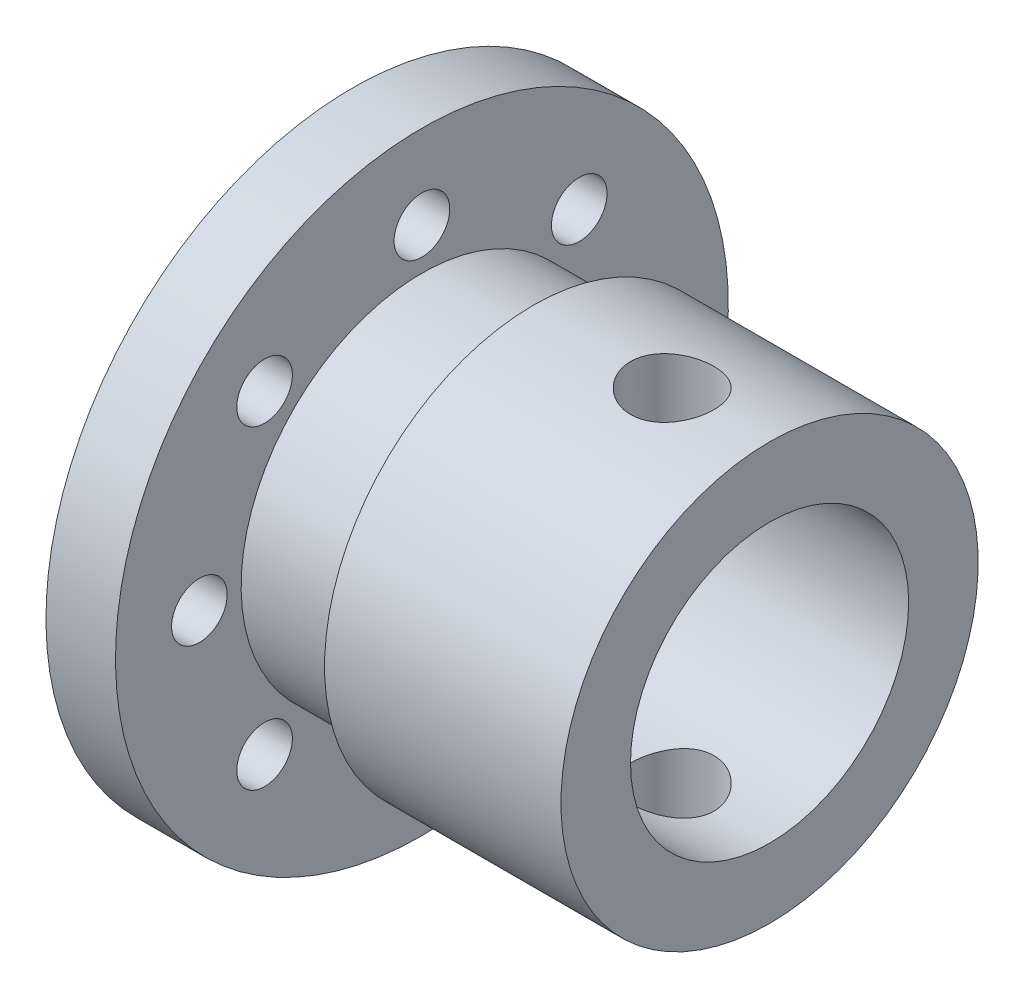
ISO-10303-21;
HEADER;
FILE_DESCRIPTION(('STEP AP214'),'2;1');
FILE_NAME('part.step','',(''),(''),'','','');
FILE_SCHEMA(('AUTOMOTIVE_DESIGN { 1 0 10303 214 1 1 1 1 }'));
ENDSEC;
DATA;
#1=APPLICATION_CONTEXT('core data for automotive mechanical design processes');
#2=APPLICATION_PROTOCOL_DEFINITION('international standard','automotive_design',2000,#1);
#3=PRODUCT_CONTEXT('',#1,'mechanical');
#4=PRODUCT('Part','Part','',(#3));
#5=PRODUCT_RELATED_PRODUCT_CATEGORY('part','',(#4));
#6=PRODUCT_DEFINITION_FORMATION('','',#4);
#7=PRODUCT_DEFINITION_CONTEXT('part definition',#1,'design');
#8=PRODUCT_DEFINITION('design','',#6,#7);
#9=PRODUCT_DEFINITION_SHAPE('','',#8);
#10=(LENGTH_UNIT() NAMED_UNIT(*) SI_UNIT(.MILLI.,.METRE.));
#11=(NAMED_UNIT(*) PLANE_ANGLE_UNIT() SI_UNIT($,.RADIAN.));
#12=(NAMED_UNIT(*) SI_UNIT($,.STERADIAN.) SOLID_ANGLE_UNIT());
#13=UNCERTAINTY_MEASURE_WITH_UNIT(LENGTH_MEASURE(1.E-05),#10,'distance_accuracy_value','');
#14=(GEOMETRIC_REPRESENTATION_CONTEXT(3) GLOBAL_UNCERTAINTY_ASSIGNED_CONTEXT((#13)) GLOBAL_UNIT_ASSIGNED_CONTEXT((#10,
#11,#12)) REPRESENTATION_CONTEXT('',''));
#15=CARTESIAN_POINT('',(0.,0.,0.));
#16=DIRECTION('',(0.,0.,1.));
#17=DIRECTION('',(1.,0.,0.));
#18=AXIS2_PLACEMENT_3D('',#15,#16,#17);
#19=CARTESIAN_POINT('',(542.916757591881,0.,0.));
#20=DIRECTION('',(-1.,0.,0.));
#21=DIRECTION('',(0.,-1.,0.));
#22=AXIS2_PLACEMENT_3D('',#19,#20,#21);
#23=CYLINDRICAL_SURFACE('',#22,11.0166045821102);
#24=CARTESIAN_POINT('',(545.650925036608,0.,0.));
#25=DIRECTION('',(-1.,0.,0.));
#26=DIRECTION('',(0.,-1.,0.));
#27=AXIS2_PLACEMENT_3D('',#24,#25,#26);
#28=CIRCLE('',#27,11.0166045821102);
#29=CARTESIAN_POINT('',(545.650925036608,-11.0166045821102,0.));
#30=VERTEX_POINT('',#29);
#31=EDGE_CURVE('E46',#30,#30,#28,.T.);
#32=ORIENTED_EDGE('',*,*,#31,.F.);
#33=EDGE_LOOP('',(#32));
#34=FACE_BOUND('',#33,.T.);
#35=CARTESIAN_POINT('',(548.150925036608,0.,0.));
#36=DIRECTION('',(-1.,0.,0.));
#37=DIRECTION('',(0.,-1.,0.));
#38=AXIS2_PLACEMENT_3D('',#35,#36,#37);
#39=CIRCLE('',#38,11.0166045821102);
#40=CARTESIAN_POINT('',(548.150925036608,-11.0166045821102,0.));
#41=VERTEX_POINT('',#40);
#42=EDGE_CURVE('E10',#41,#41,#39,.T.);
#43=ORIENTED_EDGE('',*,*,#42,.T.);
#44=EDGE_LOOP('',(#43));
#45=FACE_BOUND('',#44,.T.);
#46=ADVANCED_FACE('F34',(#34,#45),#23,.T.);
#47=CARTESIAN_POINT('',(545.650925036608,11.0166045821102,0.));
#48=DIRECTION('',(1.,0.,0.));
#49=DIRECTION('',(0.,1.,0.));
#50=AXIS2_PLACEMENT_3D('',#47,#48,#49);
#51=PLANE('',#50);
#52=CARTESIAN_POINT('',(545.650925036608,8.0000000000001,0.));
#53=DIRECTION('',(1.,0.,0.));
#54=DIRECTION('',(0.,1.,0.));
#55=AXIS2_PLACEMENT_3D('',#52,#53,#54);
#56=CIRCLE('',#55,1.);
#57=CARTESIAN_POINT('',(545.650925036608,9.0000000000001,0.));
#58=VERTEX_POINT('',#57);
#59=EDGE_CURVE('E59',#58,#58,#56,.T.);
#60=ORIENTED_EDGE('',*,*,#59,.T.);
#61=EDGE_LOOP('',(#60));
#62=FACE_BOUND('',#61,.T.);
#63=CARTESIAN_POINT('',(545.650925036608,5.65685424949288,-5.65685424949255));
#64=DIRECTION('',(1.,0.,0.));
#65=DIRECTION('',(0.,1.,0.));
#66=AXIS2_PLACEMENT_3D('',#63,#64,#65);
#67=CIRCLE('',#66,1.00000000000006);
#68=CARTESIAN_POINT('',(545.650925036608,6.65685424949294,-5.65685424949255));
#69=VERTEX_POINT('',#68);
#70=EDGE_CURVE('E113',#69,#69,#67,.T.);
#71=ORIENTED_EDGE('',*,*,#70,.T.);
#72=EDGE_LOOP('',(#71));
#73=FACE_BOUND('',#72,.T.);
#74=CARTESIAN_POINT('',(545.650925036608,6.67199061268785E-13,-8.00000000000057));
#75=DIRECTION('',(1.,0.,0.));
#76=DIRECTION('',(0.,1.,0.));
#77=AXIS2_PLACEMENT_3D('',#74,#75,#76);
#78=CIRCLE('',#77,1.0000000000004);
#79=CARTESIAN_POINT('',(545.650925036608,1.00000000000107,-8.00000000000057));
#80=VERTEX_POINT('',#79);
#81=EDGE_CURVE('E117',#80,#80,#78,.T.);
#82=ORIENTED_EDGE('',*,*,#81,.T.);
#83=EDGE_LOOP('',(#82));
#84=FACE_BOUND('',#83,.T.);
#85=CARTESIAN_POINT('',(545.650925036608,-5.65685424949188,-5.65685424949335));
#86=DIRECTION('',(1.,0.,0.));
#87=DIRECTION('',(0.,1.,0.));
#88=AXIS2_PLACEMENT_3D('',#85,#86,#87);
#89=CIRCLE('',#88,1.00000000000085);
#90=CARTESIAN_POINT('',(545.650925036608,-4.65685424949103,-5.65685424949335));
#91=VERTEX_POINT('',#90);
#92=EDGE_CURVE('E121',#91,#91,#89,.T.);
#93=ORIENTED_EDGE('',*,*,#92,.T.);
#94=EDGE_LOOP('',(#93));
#95=FACE_BOUND('',#94,.T.);
#96=CARTESIAN_POINT('',(545.650925036608,-7.9999999999999,-1.13392922489821E-12));
#97=DIRECTION('',(1.,0.,0.));
#98=DIRECTION('',(0.,1.,0.));
#99=AXIS2_PLACEMENT_3D('',#96,#97,#98);
#100=CIRCLE('',#99,1.00000000000114);
#101=CARTESIAN_POINT('',(545.650925036608,-6.99999999999876,-1.13392922489821E-12));
#102=VERTEX_POINT('',#101);
#103=EDGE_CURVE('E125',#102,#102,#100,.T.);
#104=ORIENTED_EDGE('',*,*,#103,.T.);
#105=EDGE_LOOP('',(#104));
#106=FACE_BOUND('',#105,.T.);
#107=CARTESIAN_POINT('',(545.650925036608,-5.65685424949268,5.65685424949141));
#108=DIRECTION('',(1.,0.,0.));
#109=DIRECTION('',(0.,1.,0.));
#110=AXIS2_PLACEMENT_3D('',#107,#108,#109);
#111=CIRCLE('',#110,1.00000000000111);
#112=CARTESIAN_POINT('',(545.650925036608,-4.65685424949157,5.65685424949141));
#113=VERTEX_POINT('',#112);
#114=EDGE_CURVE('E129',#113,#113,#111,.T.);
#115=ORIENTED_EDGE('',*,*,#114,.T.);
#116=EDGE_LOOP('',(#115));
#117=FACE_BOUND('',#116,.T.);
#118=CARTESIAN_POINT('',(545.650925036608,-4.6770988106874E-13,7.99999999999943));
#119=DIRECTION('',(1.,0.,0.));
#120=DIRECTION('',(0.,1.,0.));
#121=AXIS2_PLACEMENT_3D('',#118,#119,#120);
#122=CIRCLE('',#121,1.00000000000079);
#123=CARTESIAN_POINT('',(545.650925036608,1.00000000000032,7.99999999999943));
#124=VERTEX_POINT('',#123);
#125=EDGE_CURVE('E133',#124,#124,#122,.T.);
#126=ORIENTED_EDGE('',*,*,#125,.T.);
#127=EDGE_LOOP('',(#126));
#128=FACE_BOUND('',#127,.T.);
#129=CARTESIAN_POINT('',(545.650925036608,5.65685424949208,5.65685424949222));
#130=DIRECTION('',(1.,0.,0.));
#131=DIRECTION('',(0.,1.,0.));
#132=AXIS2_PLACEMENT_3D('',#129,#130,#131);
#133=CIRCLE('',#132,1.00000000000037);
#134=CARTESIAN_POINT('',(545.650925036608,6.65685424949245,5.65685424949222));
#135=VERTEX_POINT('',#134);
#136=EDGE_CURVE('E88',#135,#135,#133,.T.);
#137=ORIENTED_EDGE('',*,*,#136,.T.);
#138=EDGE_LOOP('',(#137));
#139=FACE_BOUND('',#138,.T.);
#140=CARTESIAN_POINT('',(545.650925036608,0.,0.));
#141=DIRECTION('',(-1.,0.,0.));
#142=DIRECTION('',(0.,-1.,0.));
#143=AXIS2_PLACEMENT_3D('',#140,#141,#142);
#144=CIRCLE('',#143,5.);
#145=CARTESIAN_POINT('',(545.650925036608,-5.,0.));
#146=VERTEX_POINT('',#145);
#147=EDGE_CURVE('E51',#146,#146,#144,.T.);
#148=ORIENTED_EDGE('',*,*,#147,.F.);
#149=EDGE_LOOP('',(#148));
#150=FACE_BOUND('',#149,.T.);
#151=ORIENTED_EDGE('',*,*,#31,.T.);
#152=EDGE_LOOP('',(#151));
#153=FACE_BOUND('',#152,.T.);
#154=ADVANCED_FACE('F98',(#62,#73,#84,#95,#106,#117,#128,#139,#150,#153),#51,.F.);
#155=CARTESIAN_POINT('',(542.916757591881,0.,0.));
#156=DIRECTION('',(-1.,0.,0.));
#157=DIRECTION('',(0.,-1.,0.));
#158=AXIS2_PLACEMENT_3D('',#155,#156,#157);
#159=CYLINDRICAL_SURFACE('',#158,5.);
#160=CARTESIAN_POINT('',(558.650925036608,-4.99999999999999,0.));
#161=CARTESIAN_POINT('',(558.650924039123,-4.99999929250549,0.082288612753296));
#162=CARTESIAN_POINT('',(558.644131172984,-4.99794915693953,0.164587318351522));
#163=CARTESIAN_POINT('',(558.617203682386,-4.98997105593691,0.326788125304866));
#164=CARTESIAN_POINT('',(558.597065078585,-4.98404193389692,0.406689504411403));
#165=CARTESIAN_POINT('',(558.544179019698,-4.96895552501836,0.561732707754496));
#166=CARTESIAN_POINT('',(558.511450166989,-4.95980300250425,0.636881364395333));
#167=CARTESIAN_POINT('',(558.434388943552,-4.93922109237646,0.780624181053083));
#168=CARTESIAN_POINT('',(558.390055029213,-4.92779140192067,0.849217467469621));
#169=CARTESIAN_POINT('',(558.289701029136,-4.90350737192774,0.979871797183694));
#170=CARTESIAN_POINT('',(558.233408410722,-4.89062383657037,1.04171807124429));
#171=CARTESIAN_POINT('',(558.111315806698,-4.86505834210443,1.15524920923319));
#172=CARTESIAN_POINT('',(558.045514224483,-4.85237641724502,1.20693236327436));
#173=CARTESIAN_POINT('',(557.904454283571,-4.82834113993772,1.29980037723705));
#174=CARTESIAN_POINT('',(557.829016575618,-4.81702406663875,1.34072309022211));
#175=CARTESIAN_POINT('',(557.671935782378,-4.79743620394031,1.40921394774759));
#176=CARTESIAN_POINT('',(557.59029419268,-4.7891646831331,1.43678529919973));
#177=CARTESIAN_POINT('',(557.425534770478,-4.77690870838434,1.47701633682651));
#178=CARTESIAN_POINT('',(557.342522292744,-4.77281069324533,1.49007196234675));
#179=CARTESIAN_POINT('',(557.175391880392,-4.76902789749768,1.50213730614668));
#180=CARTESIAN_POINT('',(557.091274218549,-4.76934204760572,1.50115042761075));
#181=CARTESIAN_POINT('',(556.927541128,-4.77424744067778,1.48546977199808));
#182=CARTESIAN_POINT('',(556.847872786246,-4.77868388599141,1.47127205262682));
#183=CARTESIAN_POINT('',(556.692105250335,-4.79108356228625,1.43037420427051));
#184=CARTESIAN_POINT('',(556.616006409234,-4.79904714132352,1.40367284141634));
#185=CARTESIAN_POINT('',(556.468324686948,-4.81772733074975,1.33816026653674));
#186=CARTESIAN_POINT('',(556.396817952653,-4.82848016115953,1.29918816934636));
#187=CARTESIAN_POINT('',(556.261193014598,-4.85150987000065,1.2103522258868));
#188=CARTESIAN_POINT('',(556.197076607195,-4.86378711746991,1.16048574002589));
#189=CARTESIAN_POINT('',(556.075238845846,-4.88911011297936,1.04881290765548));
#190=CARTESIAN_POINT('',(556.017896372579,-4.90216654310498,0.986594907466968));
#191=CARTESIAN_POINT('',(555.914371052544,-4.92712244063258,0.853263259313953));
#192=CARTESIAN_POINT('',(555.868188908194,-4.93902183518409,0.782149051860888));
#193=CARTESIAN_POINT('',(555.788065114144,-4.9604316006947,0.6323550383428));
#194=CARTESIAN_POINT('',(555.754207520358,-4.96992543668314,0.553627749747927));
#195=CARTESIAN_POINT('',(555.700325446509,-4.98533521832222,0.391245415603492));
#196=CARTESIAN_POINT('',(555.680297108076,-4.99125216186999,0.307591751589572));
#197=CARTESIAN_POINT('',(555.655272858709,-4.99868364643538,0.140952242668339));
#198=CARTESIAN_POINT('',(555.649763450807,-5.0003485041779,0.0580500976011944));
#199=CARTESIAN_POINT('',(555.65249419232,-4.99952923241759,-0.107499605823373));
#200=CARTESIAN_POINT('',(555.66073250626,-4.99704565677756,-0.190147196690767));
#201=CARTESIAN_POINT('',(555.69030964772,-4.98830696987162,-0.350903605309685));
#202=CARTESIAN_POINT('',(555.711348424189,-4.98213829799416,-0.429072772614161));
#203=CARTESIAN_POINT('',(555.765568269387,-4.96674347841532,-0.580754638954507));
#204=CARTESIAN_POINT('',(555.798750797646,-4.95751696321085,-0.654266777025559));
#205=CARTESIAN_POINT('',(555.87717820209,-4.93669654351324,-0.796437189461043));
#206=CARTESIAN_POINT('',(555.922684377556,-4.92505280829674,-0.864943826199686));
#207=CARTESIAN_POINT('',(556.024149790661,-4.90073468764317,-0.993523307980161));
#208=CARTESIAN_POINT('',(556.080111648496,-4.8880600443108,-1.05359403235593));
#209=CARTESIAN_POINT('',(556.203312344978,-4.86253171869138,-1.16585744551025));
#210=CARTESIAN_POINT('',(556.27088691238,-4.84968825033267,-1.21768481231502));
#211=CARTESIAN_POINT('',(556.414052975622,-4.82576515238463,-1.30928995072153));
#212=CARTESIAN_POINT('',(556.489644261167,-4.81468547654651,-1.34906803829472));
#213=CARTESIAN_POINT('',(556.646457527863,-4.79567189615055,-1.41517347127167));
#214=CARTESIAN_POINT('',(556.727651223145,-4.78772337843827,-1.44156346937048));
#215=CARTESIAN_POINT('',(556.89361300554,-4.77591594362794,-1.48021730815112));
#216=CARTESIAN_POINT('',(556.978379857396,-4.77205562508301,-1.49248598978776));
#217=CARTESIAN_POINT('',(557.145286554985,-4.76899972496088,-1.50221984485055));
#218=CARTESIAN_POINT('',(557.227388687626,-4.76961647442755,-1.50028055308486));
#219=CARTESIAN_POINT('',(557.390039139981,-4.77499401288295,-1.48307505444811));
#220=CARTESIAN_POINT('',(557.470587521785,-4.77975463592552,-1.46780938124713));
#221=CARTESIAN_POINT('',(557.626870435751,-4.79275763670387,-1.42476888804131));
#222=CARTESIAN_POINT('',(557.70265232397,-4.80095604545966,-1.39715175507061));
#223=CARTESIAN_POINT('',(557.848567475426,-4.81990278909138,-1.33031507121121));
#224=CARTESIAN_POINT('',(557.918699654249,-4.83065161194313,-1.29109329962869));
#225=CARTESIAN_POINT('',(558.054088153135,-4.85397676425834,-1.20048763805065));
#226=CARTESIAN_POINT('',(558.119073797869,-4.86660540163798,-1.14871276092988));
#227=CARTESIAN_POINT('',(558.239627534916,-4.89201320450026,-1.03517434629778));
#228=CARTESIAN_POINT('',(558.295193176076,-4.90479240823905,-0.973408217134478));
#229=CARTESIAN_POINT('',(558.396948448903,-4.92950936570648,-0.839465762183245));
#230=CARTESIAN_POINT('',(558.442816483464,-4.94141159765674,-0.767037885790604));
#231=CARTESIAN_POINT('',(558.521660206512,-4.96260680455813,-0.615141373983509));
#232=CARTESIAN_POINT('',(558.554641924883,-4.97190099931066,-0.53567605299892));
#233=CARTESIAN_POINT('',(558.603820312261,-4.98602174969301,-0.380757712655246));
#234=CARTESIAN_POINT('',(558.621436709492,-4.99122027381067,-0.305786961954212));
#235=CARTESIAN_POINT('',(558.64498856185,-4.99820944494492,-0.153880195230774));
#236=CARTESIAN_POINT('',(558.650925969313,-5.0000006615474,-0.0769445098581367));
#237=CARTESIAN_POINT('',(558.650925036608,-4.99999999999999,0.));
#238=B_SPLINE_CURVE_WITH_KNOTS('',3,(#160,#161,#162,#163,#164,#165,#166,#167,#168,#169,#170,
#171,#172,#173,#174,#175,#176,#177,#178,#179,#180,#181,#182,#183,#184,#185,#186,#187,#188,#189,
#190,#191,#192,#193,#194,#195,#196,#197,#198,#199,#200,#201,#202,#203,#204,#205,#206,#207,#208,
#209,#210,#211,#212,#213,#214,#215,#216,#217,#218,#219,#220,#221,#222,#223,#224,#225,#226,#227,
#228,#229,#230,#231,#232,#233,#234,#235,#236,#237),.UNSPECIFIED.,.T.,.F.,(4,2,2,2,2,2,2,2,2,2,2,
2,2,2,2,2,2,2,2,2,2,2,2,2,2,2,2,2,2,2,2,2,2,2,2,2,2,2,4),(0.,0.246583203612596,
0.493239964845979,0.739533676300825,0.985860164412644,1.23855602948184,1.49129437288625,
1.74971481004113,2.00807314543224,2.25919689356601,2.51025978319085,2.75226016697675,
2.99428443658001,3.23962426447117,3.48502360158542,3.74067104048159,3.99633456531061,
4.25371046881682,4.51101453528798,4.75908809438535,5.00712853550315,5.24956746682316,
5.4920355459372,5.74011305702905,5.98825282000178,6.24540400322805,6.50254844252674,
6.75847814951236,7.01432009460275,7.25950155466926,7.50467319661588,7.74680040402715,
7.98897397553104,8.23996925679914,8.49102974897479,8.74942996156656,9.0077091159522,
9.23831691930441,9.46888616948855),.UNSPECIFIED.);
#239=CARTESIAN_POINT('',(558.650925036608,-4.99999999999999,0.));
#240=VERTEX_POINT('',#239);
#241=EDGE_CURVE('E87',#240,#240,#238,.T.);
#242=ORIENTED_EDGE('',*,*,#241,.T.);
#243=EDGE_LOOP('',(#242));
#244=FACE_BOUND('',#243,.T.);
#245=CARTESIAN_POINT('',(557.150925036608,4.76969600708474,1.49999999999997));
#246=CARTESIAN_POINT('',(557.233119584551,4.76969685726981,1.49999897633761));
#247=CARTESIAN_POINT('',(557.315324260752,4.7718439020907,1.49322108167139));
#248=CARTESIAN_POINT('',(557.4773302862,4.78016578302901,1.46635844446746));
#249=CARTESIAN_POINT('',(557.55713082311,4.78634196493469,1.44626925573575));
#250=CARTESIAN_POINT('',(557.71195976488,4.80196102485633,1.39352753269952));
#251=CARTESIAN_POINT('',(557.786995866241,4.81139846703233,1.36089589394239));
#252=CARTESIAN_POINT('',(557.930546970604,4.83246932547569,1.28406421917923));
#253=CARTESIAN_POINT('',(557.999060995293,4.84410307041021,1.23986245137047));
#254=CARTESIAN_POINT('',(558.129791427186,4.86866862185766,1.13964754141622));
#255=CARTESIAN_POINT('',(558.191770934554,4.88162808311637,1.08333207175803));
#256=CARTESIAN_POINT('',(558.305562987931,4.90714861936757,0.961136237579577));
#257=CARTESIAN_POINT('',(558.357374227058,4.91970964297705,0.895254645461102));
#258=CARTESIAN_POINT('',(558.450387736442,4.94333214579389,0.754111437793699));
#259=CARTESIAN_POINT('',(558.491348461051,4.95435724342404,0.67868402133583));
#260=CARTESIAN_POINT('',(558.559912295651,4.97334435920684,0.521624645369365));
#261=CARTESIAN_POINT('',(558.587518286466,4.98130703789495,0.439994028387911));
#262=CARTESIAN_POINT('',(558.627805037699,4.99307646003589,0.275323852630831));
#263=CARTESIAN_POINT('',(558.640890164261,4.99699557369338,0.192391398953818));
#264=CARTESIAN_POINT('',(558.653042361255,5.00063201501348,0.0254218237493622));
#265=CARTESIAN_POINT('',(558.65211237601,5.00035022521079,-0.0586150620503067));
#266=CARTESIAN_POINT('',(558.636532168065,4.99569603817659,-0.222571156600092));
#267=CARTESIAN_POINT('',(558.622319842799,4.99145420205261,-0.30253626764128));
#268=CARTESIAN_POINT('',(558.581293700614,4.97951522112593,-0.45888921344247));
#269=CARTESIAN_POINT('',(558.554479085666,4.97181785750587,-0.535276821322788));
#270=CARTESIAN_POINT('',(558.48871301319,4.95365220986964,-0.683347326351229));
#271=CARTESIAN_POINT('',(558.449623833801,4.94315269676706,-0.754965064694433));
#272=CARTESIAN_POINT('',(558.36052718418,4.9204964064807,-0.890764673783103));
#273=CARTESIAN_POINT('',(558.310517123645,4.90833923637779,-0.954944774872065));
#274=CARTESIAN_POINT('',(558.198727285857,4.88311550488167,-1.07666048152973));
#275=CARTESIAN_POINT('',(558.136568117579,4.87003195321462,-1.13384458040106));
#276=CARTESIAN_POINT('',(558.003415018718,4.84483979887498,-1.23707651539819));
#277=CARTESIAN_POINT('',(557.932420211219,4.83273129317021,-1.28312324482847));
#278=CARTESIAN_POINT('',(557.782685567359,4.8107790319768,-1.36313995335442));
#279=CARTESIAN_POINT('',(557.703877990745,4.80095810695959,-1.3969898923767));
#280=CARTESIAN_POINT('',(557.541317828163,4.78496392548438,-1.45083362878407));
#281=CARTESIAN_POINT('',(557.457566865074,4.77878947915831,-1.47083194640555));
#282=CARTESIAN_POINT('',(557.290842675869,4.77104849541243,-1.49574770282162));
#283=CARTESIAN_POINT('',(557.207956812714,4.76931878670441,-1.50119946380209));
#284=CARTESIAN_POINT('',(557.042452136598,4.77021192441925,-1.49835947233058));
#285=CARTESIAN_POINT('',(556.959833287877,4.7728341615659,-1.49006964371326));
#286=CARTESIAN_POINT('',(556.799436658638,4.78197558554913,-1.46045763574187));
#287=CARTESIAN_POINT('',(556.721588872345,4.7883917650749,-1.43947961431277));
#288=CARTESIAN_POINT('',(556.570523345794,4.80429141231228,-1.38548577747937));
#289=CARTESIAN_POINT('',(556.497306322468,4.81377535359074,-1.35246810342758));
#290=CARTESIAN_POINT('',(556.355407572536,4.83505835023047,-1.274318711965));
#291=CARTESIAN_POINT('',(556.286900315623,4.84691271069798,-1.22888564172729));
#292=CARTESIAN_POINT('',(556.158286930428,4.87148205646987,-1.12755301600386));
#293=CARTESIAN_POINT('',(556.098182818996,4.88419724730003,-1.07165095534899));
#294=CARTESIAN_POINT('',(555.985744630794,4.90963633548158,-0.948455132493624));
#295=CARTESIAN_POINT('',(555.933789407621,4.92234245063004,-0.880811065857457));
#296=CARTESIAN_POINT('',(555.841958335581,4.9458485174865,-0.737461784590272));
#297=CARTESIAN_POINT('',(555.802081886827,4.95664856384717,-0.661756970543967));
#298=CARTESIAN_POINT('',(555.73592500604,4.97505970474957,-0.504935504705247));
#299=CARTESIAN_POINT('',(555.709543020449,4.98269453424965,-0.423864622037867));
#300=CARTESIAN_POINT('',(555.670864117718,4.99401979596826,-0.258169966504623));
#301=CARTESIAN_POINT('',(555.65856317066,4.9977113567088,-0.173547217354802));
#302=CARTESIAN_POINT('',(555.648701992554,5.00066544081399,-0.00665215388278732));
#303=CARTESIAN_POINT('',(555.650592341201,5.00009305111322,0.0755851790861622));
#304=CARTESIAN_POINT('',(555.667746669107,4.99497264465037,0.238519481164354));
#305=CARTESIAN_POINT('',(555.683009890089,4.99042485330463,0.319216537346474));
#306=CARTESIAN_POINT('',(555.726136698008,4.97791168358327,0.475935813041313));
#307=CARTESIAN_POINT('',(555.753863217257,4.96998352900866,0.551998927351361));
#308=CARTESIAN_POINT('',(555.821006951116,4.9515294303945,0.698433237752022));
#309=CARTESIAN_POINT('',(555.860426086895,4.94100305949947,0.768803496050534));
#310=CARTESIAN_POINT('',(555.951298494038,4.91803965828229,0.904301892420538));
#311=CARTESIAN_POINT('',(556.003096466609,4.90555226923559,0.969190250076776));
#312=CARTESIAN_POINT('',(556.116635424941,4.88023537212333,1.08953757134596));
#313=CARTESIAN_POINT('',(556.178379274506,4.86740576641079,1.14499380960193));
#314=CARTESIAN_POINT('',(556.312265814919,4.8424068063132,1.24656269394545));
#315=CARTESIAN_POINT('',(556.384663589999,4.83026852693486,1.29234759757952));
#316=CARTESIAN_POINT('',(556.536480210769,4.80852547508795,1.3710431352877));
#317=CARTESIAN_POINT('',(556.615895660209,4.79891948596957,1.40395995557282));
#318=CARTESIAN_POINT('',(556.770665468214,4.78427816717596,1.45301942532944));
#319=CARTESIAN_POINT('',(556.845533683539,4.77886154840521,1.47058859011227));
#320=CARTESIAN_POINT('',(556.997240259104,4.77157042597168,1.4940781883514));
#321=CARTESIAN_POINT('',(557.074078221254,4.76969521221432,1.50000095706092));
#322=CARTESIAN_POINT('',(557.150925036608,4.76969600708474,1.49999999999997));
#323=B_SPLINE_CURVE_WITH_KNOTS('',3,(#245,#246,#247,#248,#249,#250,#251,#252,#253,#254,#255,
#256,#257,#258,#259,#260,#261,#262,#263,#264,#265,#266,#267,#268,#269,#270,#271,#272,#273,#274,
#275,#276,#277,#278,#279,#280,#281,#282,#283,#284,#285,#286,#287,#288,#289,#290,#291,#292,#293,
#294,#295,#296,#297,#298,#299,#300,#301,#302,#303,#304,#305,#306,#307,#308,#309,#310,#311,#312,
#313,#314,#315,#316,#317,#318,#319,#320,#321,#322),.UNSPECIFIED.,.T.,.F.,(4,2,2,2,2,2,2,2,2,2,2,
2,2,2,2,2,2,2,2,2,2,2,2,2,2,2,2,2,2,2,2,2,2,2,2,2,2,2,4),(0.,0.24630016591559,0.492682641688965,
0.738656414466256,0.984667025370109,1.23773150007977,1.49082847871264,1.74915939273633,
2.00743455587871,2.25832140149547,2.50915554101425,2.75200125990867,2.99486235890362,
3.24055209335667,3.48630016590818,3.74152147023258,3.99676812491846,4.25446238246235,
4.51207250628395,4.76008080790304,5.00805439107374,5.24958594938805,5.49115481045764,
5.73920731809361,5.98731925928902,6.24479506100576,6.50225807324179,6.75775391814304,
7.01317662321659,7.25876303911197,7.50433553047731,7.74727096872197,7.99024634491357,
8.24099627054474,8.49181852629871,8.7501163966912,9.00828993963906,9.23861153857425,
9.46888695033538),.UNSPECIFIED.);
#324=CARTESIAN_POINT('',(557.150925036608,4.76969600708474,1.49999999999997));
#325=VERTEX_POINT('',#324);
#326=EDGE_CURVE('E80',#325,#325,#323,.T.);
#327=ORIENTED_EDGE('',*,*,#326,.T.);
#328=EDGE_LOOP('',(#327));
#329=FACE_BOUND('',#328,.T.);
#330=CARTESIAN_POINT('',(560.650925036608,0.,0.));
#331=DIRECTION('',(-1.,0.,0.));
#332=DIRECTION('',(0.,-1.,0.));
#333=AXIS2_PLACEMENT_3D('',#330,#331,#332);
#334=CIRCLE('',#333,5.);
#335=CARTESIAN_POINT('',(560.650925036608,-4.99999999999999,0.));
#336=VERTEX_POINT('',#335);
#337=EDGE_CURVE('E142',#336,#336,#334,.T.);
#338=ORIENTED_EDGE('',*,*,#337,.F.);
#339=EDGE_LOOP('',(#338));
#340=FACE_BOUND('',#339,.T.);
#341=ORIENTED_EDGE('',*,*,#147,.T.);
#342=EDGE_LOOP('',(#341));
#343=FACE_BOUND('',#342,.T.);
#344=ADVANCED_FACE('F94',(#244,#329,#340,#343),#159,.F.);
#345=CARTESIAN_POINT('',(560.650925036608,5.,0.));
#346=DIRECTION('',(-1.,0.,0.));
#347=DIRECTION('',(0.,-1.,0.));
#348=AXIS2_PLACEMENT_3D('',#345,#346,#347);
#349=PLANE('',#348);
#350=CARTESIAN_POINT('',(560.650925036608,0.,0.));
#351=DIRECTION('',(-1.,0.,0.));
#352=DIRECTION('',(0.,-1.,0.));
#353=AXIS2_PLACEMENT_3D('',#350,#351,#352);
#354=CIRCLE('',#353,7.5);
#355=CARTESIAN_POINT('',(560.650925036608,-7.49999999999999,0.));
#356=VERTEX_POINT('',#355);
#357=EDGE_CURVE('E144',#356,#356,#354,.T.);
#358=ORIENTED_EDGE('',*,*,#357,.F.);
#359=EDGE_LOOP('',(#358));
#360=FACE_BOUND('',#359,.T.);
#361=ORIENTED_EDGE('',*,*,#337,.T.);
#362=EDGE_LOOP('',(#361));
#363=FACE_BOUND('',#362,.T.);
#364=ADVANCED_FACE('F97',(#360,#363),#349,.F.);
#365=CARTESIAN_POINT('',(542.916757591881,0.,0.));
#366=DIRECTION('',(-1.,0.,0.));
#367=DIRECTION('',(0.,-1.,0.));
#368=AXIS2_PLACEMENT_3D('',#365,#366,#367);
#369=CYLINDRICAL_SURFACE('',#368,7.5);
#370=CARTESIAN_POINT('',(558.650925036608,-7.49999999999999,0.));
#371=CARTESIAN_POINT('',(558.650921969861,-7.49999846371306,-0.0833653601889453));
#372=CARTESIAN_POINT('',(558.643951772157,-7.49859577767346,-0.166769490302273));
#373=CARTESIAN_POINT('',(558.616277286435,-7.49313548434846,-0.331220261533513));
#374=CARTESIAN_POINT('',(558.595562087406,-7.48907576790279,-0.412264976312018));
#375=CARTESIAN_POINT('',(558.541063126177,-7.4787547391743,-0.569595457894932));
#376=CARTESIAN_POINT('',(558.507291881341,-7.47249553615077,-0.645885701899641));
#377=CARTESIAN_POINT('',(558.427676665341,-7.45845597052972,-0.791711983296277));
#378=CARTESIAN_POINT('',(558.381833413198,-7.4506756985356,-0.861248422613676));
#379=CARTESIAN_POINT('',(558.278717295171,-7.43433247994954,-0.99254021597226));
#380=CARTESIAN_POINT('',(558.221312503522,-7.42576118256521,-1.05419092673774));
#381=CARTESIAN_POINT('',(558.096986412021,-7.40886270678883,-1.16705513491199));
#382=CARTESIAN_POINT('',(558.030064369606,-7.40053554750636,-1.21826781715558));
#383=CARTESIAN_POINT('',(557.887850747091,-7.38498662718923,-1.30924763002138));
#384=CARTESIAN_POINT('',(557.812488570914,-7.37777561047419,-1.34890640829876));
#385=CARTESIAN_POINT('',(557.656002308102,-7.36539402087627,-1.41495849987042));
#386=CARTESIAN_POINT('',(557.574878791589,-7.36022324642943,-1.44135312365581));
#387=CARTESIAN_POINT('',(557.410298490747,-7.35259207878307,-1.47978794982719));
#388=CARTESIAN_POINT('',(557.326886220395,-7.35009705160782,-1.49201174693812));
#389=CARTESIAN_POINT('',(557.159160304562,-7.34799562590941,-1.50232819158915));
#390=CARTESIAN_POINT('',(557.074846752128,-7.34838893201761,-1.50042228407023));
#391=CARTESIAN_POINT('',(556.909054854577,-7.35198826722277,-1.48268185965271));
#392=CARTESIAN_POINT('',(556.827552928167,-7.35515179288145,-1.46705781036583));
#393=CARTESIAN_POINT('',(556.668350921614,-7.36386819240001,-1.42265682693457));
#394=CARTESIAN_POINT('',(556.59065102323,-7.36942118036667,-1.39387926465103));
#395=CARTESIAN_POINT('',(556.440652144053,-7.38233427750611,-1.32378717551208));
#396=CARTESIAN_POINT('',(556.368393217255,-7.38970634720557,-1.28238922684814));
#397=CARTESIAN_POINT('',(556.231768761649,-7.40541928159593,-1.18829036185897));
#398=CARTESIAN_POINT('',(556.167404141332,-7.41376025757549,-1.13558814653522));
#399=CARTESIAN_POINT('',(556.047180932923,-7.43065531862192,-1.01924990184087));
#400=CARTESIAN_POINT('',(555.99149618482,-7.43921053816357,-0.955434241818669));
#401=CARTESIAN_POINT('',(555.891594267157,-7.45543273071612,-0.819277536093032));
#402=CARTESIAN_POINT('',(555.847377244668,-7.46309969233459,-0.74693638106911));
#403=CARTESIAN_POINT('',(555.77163377277,-7.4767003524133,-0.595589080318429));
#404=CARTESIAN_POINT('',(555.740127196142,-7.48263133272407,-0.516572729378009));
#405=CARTESIAN_POINT('',(555.69088432555,-7.49207113481786,-0.354223464673041));
#406=CARTESIAN_POINT('',(555.673146363498,-7.49558025000796,-0.270891075108691));
#407=CARTESIAN_POINT('',(555.652190355917,-7.49974007800301,-0.103769108440723));
#408=CARTESIAN_POINT('',(555.648734407298,-7.50043761978704,-0.0200104924883693));
#409=CARTESIAN_POINT('',(555.655799825022,-7.49902577895153,0.146887401289046));
#410=CARTESIAN_POINT('',(555.666320405637,-7.49691655412169,0.230026713665654));
#411=CARTESIAN_POINT('',(555.700842596924,-7.49015748012026,0.392558489919779));
#412=CARTESIAN_POINT('',(555.724722139355,-7.48553064606309,0.471977922509838));
#413=CARTESIAN_POINT('',(555.785151010592,-7.47425328091549,0.625685441249479));
#414=CARTESIAN_POINT('',(555.821701288624,-7.4676025982134,0.699973142456269));
#415=CARTESIAN_POINT('',(555.906948772585,-7.45289867299941,0.842311760529285));
#416=CARTESIAN_POINT('',(555.955789208167,-7.44482925655577,0.910275190128261));
#417=CARTESIAN_POINT('',(556.064038823419,-7.42822102244823,1.03712702867878));
#418=CARTESIAN_POINT('',(556.123449136208,-7.41968215452582,1.09601446339608));
#419=CARTESIAN_POINT('',(556.252235064445,-7.40293955335448,1.2039608861612));
#420=CARTESIAN_POINT('',(556.32174865294,-7.39474290349956,1.25285655367295));
#421=CARTESIAN_POINT('',(556.468142078643,-7.37976287694291,1.33827813007679));
#422=CARTESIAN_POINT('',(556.545021620969,-7.37297944370014,1.37480453388432));
#423=CARTESIAN_POINT('',(556.703577405833,-7.36165110876574,1.43422776237291));
#424=CARTESIAN_POINT('',(556.785226298424,-7.3570946230828,1.45719524968655));
#425=CARTESIAN_POINT('',(556.951325216845,-7.35071155188038,1.48906297744077));
#426=CARTESIAN_POINT('',(557.035774875922,-7.34888461036667,1.49796505233764));
#427=CARTESIAN_POINT('',(557.203438333425,-7.34818724447069,1.50138136630116));
#428=CARTESIAN_POINT('',(557.286646759999,-7.34926378783952,1.49615368210629));
#429=CARTESIAN_POINT('',(557.450972511466,-7.35413360226921,1.47202845615004));
#430=CARTESIAN_POINT('',(557.532089853151,-7.35792685150754,1.45313102419392));
#431=CARTESIAN_POINT('',(557.689766603469,-7.36777896328737,1.40231785274842));
#432=CARTESIAN_POINT('',(557.766336577362,-7.37383231528245,1.370433760076));
#433=CARTESIAN_POINT('',(557.91308061771,-7.38752572461255,1.2945819669024));
#434=CARTESIAN_POINT('',(557.983254147196,-7.3951659149834,1.25061325316233));
#435=CARTESIAN_POINT('',(558.116498394834,-7.41133440784837,1.15095887217964));
#436=CARTESIAN_POINT('',(558.17942818451,-7.41987559364549,1.09508683085277));
#437=CARTESIAN_POINT('',(558.295104344902,-7.43679122807932,0.973596553519694));
#438=CARTESIAN_POINT('',(558.347848372084,-7.44516563794776,0.907976080729996));
#439=CARTESIAN_POINT('',(558.442177002528,-7.46090748581956,0.768026443632385));
#440=CARTESIAN_POINT('',(558.483639041528,-7.46826346828868,0.693613326644772));
#441=CARTESIAN_POINT('',(558.553404220503,-7.48102687627499,0.538749541411095));
#442=CARTESIAN_POINT('',(558.581719220907,-7.48643605707923,0.458304391294657));
#443=CARTESIAN_POINT('',(558.618902958675,-7.49364558893055,0.314732233385627));
#444=CARTESIAN_POINT('',(558.63088982717,-7.49601454737677,0.252422496020646));
#445=CARTESIAN_POINT('',(558.646901905146,-7.49919231209838,0.126749287815087));
#446=CARTESIAN_POINT('',(558.650927368373,-7.50000116809732,0.0633858506229214));
#447=CARTESIAN_POINT('',(558.650925036608,-7.49999999999999,0.));
#448=B_SPLINE_CURVE_WITH_KNOTS('',3,(#370,#371,#372,#373,#374,#375,#376,#377,#378,#379,#380,
#381,#382,#383,#384,#385,#386,#387,#388,#389,#390,#391,#392,#393,#394,#395,#396,#397,#398,#399,
#400,#401,#402,#403,#404,#405,#406,#407,#408,#409,#410,#411,#412,#413,#414,#415,#416,#417,#418,
#419,#420,#421,#422,#423,#424,#425,#426,#427,#428,#429,#430,#431,#432,#433,#434,#435,#436,#437,
#438,#439,#440,#441,#442,#443,#444,#445,#446,#447),.UNSPECIFIED.,.T.,.F.,(4,2,2,2,2,2,2,2,2,2,2,
2,2,2,2,2,2,2,2,2,2,2,2,2,2,2,2,2,2,2,2,2,2,2,2,2,2,2,4),(0.,0.249864195991869,
0.499926976036955,0.749750602875434,0.999559353346243,1.25239900516818,1.50525839512103,
1.76041792508883,2.01555224047788,2.26734277655369,2.51910756421825,2.76707590509404,
3.01505608880582,3.26471235305384,3.51439732124501,3.76857378737015,4.02275351309713,
4.27732912281021,4.53187388547045,4.78216103514387,5.03243411486789,5.28045680926074,
5.52849808824022,5.77957599050023,6.03068082518879,6.28560942868822,6.54052783085187,
6.79410571549079,7.04765052495614,7.29659583851546,7.54553915238896,7.79387941879648,
8.04224051372776,8.29482114358703,8.54745981799371,8.80274245013437,9.05779433276263,
9.24778162934824,9.43776287056475),.UNSPECIFIED.);
#449=CARTESIAN_POINT('',(558.650925036608,-7.49999999999999,0.));
#450=VERTEX_POINT('',#449);
#451=EDGE_CURVE('E37',#450,#450,#448,.T.);
#452=ORIENTED_EDGE('',*,*,#451,.T.);
#453=EDGE_LOOP('',(#452));
#454=FACE_BOUND('',#453,.T.);
#455=CARTESIAN_POINT('',(557.150925036608,7.34846922834954,1.49999999999997));
#456=CARTESIAN_POINT('',(557.067578473373,7.3484708853835,1.49999691881231));
#457=CARTESIAN_POINT('',(556.984193101609,7.34990262402619,1.49302975757704));
#458=CARTESIAN_POINT('',(556.819781278893,7.35546646957747,1.46536842537439));
#459=CARTESIAN_POINT('',(556.738756769654,7.35960073717298,1.44466327060575));
#460=CARTESIAN_POINT('',(556.581469081577,7.37008310582666,1.39019367392954));
#461=CARTESIAN_POINT('',(556.505201254309,7.37642900431582,1.35644222122889));
#462=CARTESIAN_POINT('',(556.359412769563,7.39061699221019,1.27687366150573));
#463=CARTESIAN_POINT('',(556.289891735801,7.39845899810201,1.23105722790168));
#464=CARTESIAN_POINT('',(556.158583530828,7.41487949541371,1.1279686134801));
#465=CARTESIAN_POINT('',(556.096905654782,7.42346606755868,1.07055848386993));
#466=CARTESIAN_POINT('',(555.98398873624,7.440337084539,0.946210183531933));
#467=CARTESIAN_POINT('',(555.932750425483,7.44862150816248,0.879271345466946));
#468=CARTESIAN_POINT('',(555.841743010166,7.46404194626342,0.737042033886378));
#469=CARTESIAN_POINT('',(555.802077765883,7.47116732162325,0.661683851508329));
#470=CARTESIAN_POINT('',(555.736012631036,7.48337605325447,0.50520622558092));
#471=CARTESIAN_POINT('',(555.709611498757,7.48845960066179,0.424087322130822));
#472=CARTESIAN_POINT('',(555.671164246179,7.49595481032627,0.259525159917716));
#473=CARTESIAN_POINT('',(555.658933570252,7.4984007943219,0.176126608822199));
#474=CARTESIAN_POINT('',(555.648598608851,7.50046381775405,0.00842785265629227));
#475=CARTESIAN_POINT('',(555.65049296214,7.50008112979138,-0.0758722647477699));
#476=CARTESIAN_POINT('',(555.668214306932,7.49655652302773,-0.241713001115379));
#477=CARTESIAN_POINT('',(555.68384250236,7.49345397548757,-0.323275821447699));
#478=CARTESIAN_POINT('',(555.728272585297,7.48488265739113,-0.482597439870435));
#479=CARTESIAN_POINT('',(555.757074999896,7.47941379216059,-0.560356085620666));
#480=CARTESIAN_POINT('',(555.827220096829,7.46665944029938,-0.710429194801306));
#481=CARTESIAN_POINT('',(555.868640663266,7.45936272262835,-0.782706261200839));
#482=CARTESIAN_POINT('',(555.962788652463,7.44375704210678,-0.919357568789613));
#483=CARTESIAN_POINT('',(556.015517376264,7.43544796282834,-0.983730899287454));
#484=CARTESIAN_POINT('',(556.131875469771,7.4185644654669,-1.10392714658012));
#485=CARTESIAN_POINT('',(556.195678816703,7.40998794686275,-1.1595814748604));
#486=CARTESIAN_POINT('',(556.331799700284,7.39367357398141,-1.25942773976518));
#487=CARTESIAN_POINT('',(556.404117397933,7.38593573556823,-1.30361945959159));
#488=CARTESIAN_POINT('',(556.555456284341,7.37217071209386,-1.37934422220278));
#489=CARTESIAN_POINT('',(556.634491488068,7.36614722345324,-1.41084997166652));
#490=CARTESIAN_POINT('',(556.796882022194,7.3565471448191,-1.46008551244133));
#491=CARTESIAN_POINT('',(556.880236788037,7.35297023592642,-1.47781709918493));
#492=CARTESIAN_POINT('',(557.047372323607,7.34873218901742,-1.49874900905404));
#493=CARTESIAN_POINT('',(557.131121398074,7.34802220585732,-1.50219278834683));
#494=CARTESIAN_POINT('',(557.297997371408,7.34946728533281,-1.49510644246608));
#495=CARTESIAN_POINT('',(557.381124305287,7.35162218550582,-1.48457710968363));
#496=CARTESIAN_POINT('',(557.543577997047,7.35850848742372,-1.45005331211119));
#497=CARTESIAN_POINT('',(557.622933551162,7.36321498521746,-1.4261889312589));
#498=CARTESIAN_POINT('',(557.776519955152,7.37465234027498,-1.36581155296273));
#499=CARTESIAN_POINT('',(557.850750382262,7.38138336429405,-1.32929751355973));
#500=CARTESIAN_POINT('',(557.993044701534,7.3962210894306,-1.24410621332335));
#501=CARTESIAN_POINT('',(558.06101560606,7.40434457797356,-1.19527661697407));
#502=CARTESIAN_POINT('',(558.18788750461,7.42100585739956,-1.08704335831901));
#503=CARTESIAN_POINT('',(558.246787563982,7.42954369085728,-1.02763860771676));
#504=CARTESIAN_POINT('',(558.354768875387,7.44623018803824,-0.8988484102468));
#505=CARTESIAN_POINT('',(558.403685518583,7.45437086563026,-0.829323748394405));
#506=CARTESIAN_POINT('',(558.489143858858,7.4692069144293,-0.682901844952105));
#507=CARTESIAN_POINT('',(558.525686075625,7.47590234632816,-0.606004913150249));
#508=CARTESIAN_POINT('',(558.585118344228,7.487059410916,-0.447454021236032));
#509=CARTESIAN_POINT('',(558.608085813948,7.49153368713906,-0.365830010217137));
#510=CARTESIAN_POINT('',(558.639961908104,7.4977985390649,-0.199784182019887));
#511=CARTESIAN_POINT('',(558.648872225822,7.49958943799765,-0.11536270306683));
#512=CARTESIAN_POINT('',(558.652315508053,7.50027810681181,0.0523093408554365));
#513=CARTESIAN_POINT('',(558.647095957293,7.49922567824026,0.135554718212256));
#514=CARTESIAN_POINT('',(558.622974110787,7.49445065340476,0.299956546973461));
#515=CARTESIAN_POINT('',(558.604071987086,7.49072809071528,0.381113024630532));
#516=CARTESIAN_POINT('',(558.553231548471,7.481032475475,0.538879124617622));
#517=CARTESIAN_POINT('',(558.521322969411,7.47506455871866,0.615498664860386));
#518=CARTESIAN_POINT('',(558.445406674612,7.46152083185077,0.762331830278887));
#519=CARTESIAN_POINT('',(558.401398002753,7.45394489468828,0.832544948651083));
#520=CARTESIAN_POINT('',(558.301695956015,7.43786398736791,0.965795835159512));
#521=CARTESIAN_POINT('',(558.245825532028,7.4293460013317,1.02869957417473));
#522=CARTESIAN_POINT('',(558.124349676465,7.41241834355477,1.14432392663525));
#523=CARTESIAN_POINT('',(558.058741942405,7.40400869794476,1.19704212480406));
#524=CARTESIAN_POINT('',(557.918806061558,7.38815014124781,1.29133832918277));
#525=CARTESIAN_POINT('',(557.844391594868,7.38071255446371,1.33279022195959));
#526=CARTESIAN_POINT('',(557.689525876659,7.36777855777287,1.40253607393173));
#527=CARTESIAN_POINT('',(557.609080178562,7.36228038807749,1.43084196896906));
#528=CARTESIAN_POINT('',(557.465531353453,7.3549452169166,1.46800370978128));
#529=CARTESIAN_POINT('',(557.40324690734,7.35253177367825,1.4799808477841));
#530=CARTESIAN_POINT('',(557.277624104779,7.34929317692711,1.49598002694094));
#531=CARTESIAN_POINT('',(557.214285784741,7.34846796865859,1.50000234234436));
#532=CARTESIAN_POINT('',(557.150925036608,7.34846922834954,1.49999999999997));
#533=B_SPLINE_CURVE_WITH_KNOTS('',3,(#455,#456,#457,#458,#459,#460,#461,#462,#463,#464,#465,
#466,#467,#468,#469,#470,#471,#472,#473,#474,#475,#476,#477,#478,#479,#480,#481,#482,#483,#484,
#485,#486,#487,#488,#489,#490,#491,#492,#493,#494,#495,#496,#497,#498,#499,#500,#501,#502,#503,
#504,#505,#506,#507,#508,#509,#510,#511,#512,#513,#514,#515,#516,#517,#518,#519,#520,#521,#522,
#523,#524,#525,#526,#527,#528,#529,#530,#531,#532),.UNSPECIFIED.,.T.,.F.,(4,2,2,2,2,2,2,2,2,2,2,
2,2,2,2,2,2,2,2,2,2,2,2,2,2,2,2,2,2,2,2,2,2,2,2,2,2,2,4),(0.,0.249807695804051,
0.499815358926456,0.749574746910828,0.999320197289806,1.25223378822657,1.50516510053125,
1.76030100656169,2.01541302369838,2.26716373324617,2.51889018174367,2.76703184450299,
3.01518343610621,3.26489886333446,3.51464303655093,3.76874020143709,4.02284217184069,
4.27748794759157,4.53210052524025,4.78235636706871,5.0325980179262,5.28044012674972,
5.52830265531595,5.7793958966177,6.03051499305301,6.28548902600164,6.54045234945139,
6.79394720367955,7.04741152037424,7.29646526122012,7.54551587050116,7.79400025613157,
8.04250428202003,8.29501728038374,8.54759008334653,8.80288347868536,9.05794462633388,
9.24785705455325,9.43776293526297),.UNSPECIFIED.);
#534=CARTESIAN_POINT('',(557.150925036608,7.34846922834954,1.49999999999997));
#535=VERTEX_POINT('',#534);
#536=EDGE_CURVE('E54',#535,#535,#533,.T.);
#537=ORIENTED_EDGE('',*,*,#536,.T.);
#538=EDGE_LOOP('',(#537));
#539=FACE_BOUND('',#538,.T.);
#540=CARTESIAN_POINT('',(552.150925036608,0.,0.));
#541=DIRECTION('',(-1.,0.,0.));
#542=DIRECTION('',(0.,-1.,0.));
#543=AXIS2_PLACEMENT_3D('',#540,#541,#542);
#544=CIRCLE('',#543,7.5);
#545=CARTESIAN_POINT('',(552.150925036608,-7.5,0.));
#546=VERTEX_POINT('',#545);
#547=EDGE_CURVE('E149',#546,#546,#544,.T.);
#548=ORIENTED_EDGE('',*,*,#547,.F.);
#549=EDGE_LOOP('',(#548));
#550=FACE_BOUND('',#549,.T.);
#551=ORIENTED_EDGE('',*,*,#357,.T.);
#552=EDGE_LOOP('',(#551));
#553=FACE_BOUND('',#552,.T.);
#554=ADVANCED_FACE('F60',(#454,#539,#550,#553),#369,.T.);
#555=CARTESIAN_POINT('',(552.150925036608,6.5,0.));
#556=DIRECTION('',(1.,0.,0.));
#557=DIRECTION('',(0.,1.,0.));
#558=AXIS2_PLACEMENT_3D('',#555,#556,#557);
#559=PLANE('',#558);
#560=CARTESIAN_POINT('',(552.150925036608,0.,0.));
#561=DIRECTION('',(-1.,0.,0.));
#562=DIRECTION('',(0.,-1.,0.));
#563=AXIS2_PLACEMENT_3D('',#560,#561,#562);
#564=CIRCLE('',#563,6.5);
#565=CARTESIAN_POINT('',(552.150925036608,-6.5,0.));
#566=VERTEX_POINT('',#565);
#567=EDGE_CURVE('E152',#566,#566,#564,.T.);
#568=ORIENTED_EDGE('',*,*,#567,.F.);
#569=EDGE_LOOP('',(#568));
#570=FACE_BOUND('',#569,.T.);
#571=ORIENTED_EDGE('',*,*,#547,.T.);
#572=EDGE_LOOP('',(#571));
#573=FACE_BOUND('',#572,.T.);
#574=ADVANCED_FACE('F171',(#570,#573),#559,.F.);
#575=CARTESIAN_POINT('',(542.916757591881,0.,0.));
#576=DIRECTION('',(-1.,0.,0.));
#577=DIRECTION('',(0.,-1.,0.));
#578=AXIS2_PLACEMENT_3D('',#575,#576,#577);
#579=CYLINDRICAL_SURFACE('',#578,6.5);
#580=CARTESIAN_POINT('',(548.150925036608,0.,0.));
#581=DIRECTION('',(-1.,0.,0.));
#582=DIRECTION('',(0.,-1.,0.));
#583=AXIS2_PLACEMENT_3D('',#580,#581,#582);
#584=CIRCLE('',#583,6.5);
#585=CARTESIAN_POINT('',(548.150925036608,-6.5,0.));
#586=VERTEX_POINT('',#585);
#587=EDGE_CURVE('E154',#586,#586,#584,.T.);
#588=ORIENTED_EDGE('',*,*,#587,.F.);
#589=EDGE_LOOP('',(#588));
#590=FACE_BOUND('',#589,.T.);
#591=ORIENTED_EDGE('',*,*,#567,.T.);
#592=EDGE_LOOP('',(#591));
#593=FACE_BOUND('',#592,.T.);
#594=ADVANCED_FACE('F178',(#590,#593),#579,.T.);
#595=CARTESIAN_POINT('',(548.150925036608,7.5,0.));
#596=DIRECTION('',(-1.,0.,0.));
#597=DIRECTION('',(0.,-1.,0.));
#598=AXIS2_PLACEMENT_3D('',#595,#596,#597);
#599=PLANE('',#598);
#600=CARTESIAN_POINT('',(548.150925036608,8.0000000000001,0.));
#601=DIRECTION('',(1.,0.,0.));
#602=DIRECTION('',(0.,1.,0.));
#603=AXIS2_PLACEMENT_3D('',#600,#601,#602);
#604=CIRCLE('',#603,1.);
#605=CARTESIAN_POINT('',(548.150925036608,9.0000000000001,0.));
#606=VERTEX_POINT('',#605);
#607=EDGE_CURVE('E201',#606,#606,#604,.T.);
#608=ORIENTED_EDGE('',*,*,#607,.F.);
#609=EDGE_LOOP('',(#608));
#610=FACE_BOUND('',#609,.T.);
#611=CARTESIAN_POINT('',(548.150925036608,5.65685424949288,-5.65685424949255));
#612=DIRECTION('',(1.,0.,0.));
#613=DIRECTION('',(0.,1.,0.));
#614=AXIS2_PLACEMENT_3D('',#611,#612,#613);
#615=CIRCLE('',#614,1.00000000000006);
#616=CARTESIAN_POINT('',(548.150925036608,6.65685424949294,-5.65685424949255));
#617=VERTEX_POINT('',#616);
#618=EDGE_CURVE('E205',#617,#617,#615,.T.);
#619=ORIENTED_EDGE('',*,*,#618,.F.);
#620=EDGE_LOOP('',(#619));
#621=FACE_BOUND('',#620,.T.);
#622=CARTESIAN_POINT('',(548.150925036608,6.67658303818465E-13,-8.00000000000057));
#623=DIRECTION('',(1.,0.,0.));
#624=DIRECTION('',(0.,1.,0.));
#625=AXIS2_PLACEMENT_3D('',#622,#623,#624);
#626=CIRCLE('',#625,1.0000000000004);
#627=CARTESIAN_POINT('',(548.150925036608,1.00000000000107,-8.00000000000057));
#628=VERTEX_POINT('',#627);
#629=EDGE_CURVE('E209',#628,#628,#626,.T.);
#630=ORIENTED_EDGE('',*,*,#629,.F.);
#631=EDGE_LOOP('',(#630));
#632=FACE_BOUND('',#631,.T.);
#633=CARTESIAN_POINT('',(548.150925036608,-5.65685424949188,-5.65685424949335));
#634=DIRECTION('',(1.,0.,0.));
#635=DIRECTION('',(0.,1.,0.));
#636=AXIS2_PLACEMENT_3D('',#633,#634,#635);
#637=CIRCLE('',#636,1.00000000000085);
#638=CARTESIAN_POINT('',(548.150925036608,-4.65685424949103,-5.65685424949335));
#639=VERTEX_POINT('',#638);
#640=EDGE_CURVE('E213',#639,#639,#637,.T.);
#641=ORIENTED_EDGE('',*,*,#640,.F.);
#642=EDGE_LOOP('',(#641));
#643=FACE_BOUND('',#642,.T.);
#644=CARTESIAN_POINT('',(548.150925036608,-7.9999999999999,-1.13392922489821E-12));
#645=DIRECTION('',(1.,0.,0.));
#646=DIRECTION('',(0.,1.,0.));
#647=AXIS2_PLACEMENT_3D('',#644,#645,#646);
#648=CIRCLE('',#647,1.00000000000114);
#649=CARTESIAN_POINT('',(548.150925036608,-6.99999999999876,-1.13392922489821E-12));
#650=VERTEX_POINT('',#649);
#651=EDGE_CURVE('E217',#650,#650,#648,.T.);
#652=ORIENTED_EDGE('',*,*,#651,.F.);
#653=EDGE_LOOP('',(#652));
#654=FACE_BOUND('',#653,.T.);
#655=CARTESIAN_POINT('',(548.150925036608,-5.65685424949268,5.65685424949141));
#656=DIRECTION('',(1.,0.,0.));
#657=DIRECTION('',(0.,1.,0.));
#658=AXIS2_PLACEMENT_3D('',#655,#656,#657);
#659=CIRCLE('',#658,1.00000000000111);
#660=CARTESIAN_POINT('',(548.150925036608,-4.65685424949157,5.65685424949141));
#661=VERTEX_POINT('',#660);
#662=EDGE_CURVE('E221',#661,#661,#659,.T.);
#663=ORIENTED_EDGE('',*,*,#662,.F.);
#664=EDGE_LOOP('',(#663));
#665=FACE_BOUND('',#664,.T.);
#666=CARTESIAN_POINT('',(548.150925036608,-4.6725063851906E-13,7.99999999999943));
#667=DIRECTION('',(1.,0.,0.));
#668=DIRECTION('',(0.,1.,0.));
#669=AXIS2_PLACEMENT_3D('',#666,#667,#668);
#670=CIRCLE('',#669,1.00000000000079);
#671=CARTESIAN_POINT('',(548.150925036608,1.00000000000032,7.99999999999943));
#672=VERTEX_POINT('',#671);
#673=EDGE_CURVE('E225',#672,#672,#670,.T.);
#674=ORIENTED_EDGE('',*,*,#673,.F.);
#675=EDGE_LOOP('',(#674));
#676=FACE_BOUND('',#675,.T.);
#677=CARTESIAN_POINT('',(548.150925036608,5.65685424949208,5.65685424949221));
#678=DIRECTION('',(1.,0.,0.));
#679=DIRECTION('',(0.,1.,0.));
#680=AXIS2_PLACEMENT_3D('',#677,#678,#679);
#681=CIRCLE('',#680,1.00000000000037);
#682=CARTESIAN_POINT('',(548.150925036608,6.65685424949245,5.65685424949221));
#683=VERTEX_POINT('',#682);
#684=EDGE_CURVE('E229',#683,#683,#681,.T.);
#685=ORIENTED_EDGE('',*,*,#684,.F.);
#686=EDGE_LOOP('',(#685));
#687=FACE_BOUND('',#686,.T.);
#688=ORIENTED_EDGE('',*,*,#42,.F.);
#689=EDGE_LOOP('',(#688));
#690=FACE_BOUND('',#689,.T.);
#691=ORIENTED_EDGE('',*,*,#587,.T.);
#692=EDGE_LOOP('',(#691));
#693=FACE_BOUND('',#692,.T.);
#694=ADVANCED_FACE('F73',(#610,#621,#632,#643,#654,#665,#676,#687,#690,#693),#599,.F.);
#695=CARTESIAN_POINT('',(557.150925036608,-11.0166045821102,0.));
#696=DIRECTION('',(0.,1.,0.));
#697=DIRECTION('',(0.,0.,1.));
#698=AXIS2_PLACEMENT_3D('',#695,#696,#697);
#699=CYLINDRICAL_SURFACE('',#698,1.49999999999997);
#700=ORIENTED_EDGE('',*,*,#536,.F.);
#701=EDGE_LOOP('',(#700));
#702=FACE_BOUND('',#701,.T.);
#703=ORIENTED_EDGE('',*,*,#326,.F.);
#704=EDGE_LOOP('',(#703));
#705=FACE_BOUND('',#704,.T.);
#706=ADVANCED_FACE('F70',(#702,#705),#699,.F.);
#707=ORIENTED_EDGE('',*,*,#451,.F.);
#708=EDGE_LOOP('',(#707));
#709=FACE_BOUND('',#708,.T.);
#710=ORIENTED_EDGE('',*,*,#241,.F.);
#711=EDGE_LOOP('',(#710));
#712=FACE_BOUND('',#711,.T.);
#713=ADVANCED_FACE('F64',(#709,#712),#699,.F.);
#714=CARTESIAN_POINT('',(545.650925036608,5.65685424949208,5.65685424949222));
#715=DIRECTION('',(1.,0.,0.));
#716=DIRECTION('',(0.,1.,0.));
#717=AXIS2_PLACEMENT_3D('',#714,#715,#716);
#718=CYLINDRICAL_SURFACE('',#717,1.00000000000037);
#719=ORIENTED_EDGE('',*,*,#136,.F.);
#720=EDGE_LOOP('',(#719));
#721=FACE_BOUND('',#720,.T.);
#722=ORIENTED_EDGE('',*,*,#684,.T.);
#723=EDGE_LOOP('',(#722));
#724=FACE_BOUND('',#723,.T.);
#725=ADVANCED_FACE('F69',(#721,#724),#718,.F.);
#726=CARTESIAN_POINT('',(545.650925036608,-4.6770988106874E-13,7.99999999999943));
#727=DIRECTION('',(1.,0.,0.));
#728=DIRECTION('',(0.,1.,0.));
#729=AXIS2_PLACEMENT_3D('',#726,#727,#728);
#730=CYLINDRICAL_SURFACE('',#729,1.00000000000079);
#731=ORIENTED_EDGE('',*,*,#125,.F.);
#732=EDGE_LOOP('',(#731));
#733=FACE_BOUND('',#732,.T.);
#734=ORIENTED_EDGE('',*,*,#673,.T.);
#735=EDGE_LOOP('',(#734));
#736=FACE_BOUND('',#735,.T.);
#737=ADVANCED_FACE('F271',(#733,#736),#730,.F.);
#738=CARTESIAN_POINT('',(545.650925036608,-5.65685424949268,5.65685424949141));
#739=DIRECTION('',(1.,0.,0.));
#740=DIRECTION('',(0.,1.,0.));
#741=AXIS2_PLACEMENT_3D('',#738,#739,#740);
#742=CYLINDRICAL_SURFACE('',#741,1.00000000000111);
#743=ORIENTED_EDGE('',*,*,#114,.F.);
#744=EDGE_LOOP('',(#743));
#745=FACE_BOUND('',#744,.T.);
#746=ORIENTED_EDGE('',*,*,#662,.T.);
#747=EDGE_LOOP('',(#746));
#748=FACE_BOUND('',#747,.T.);
#749=ADVANCED_FACE('F268',(#745,#748),#742,.F.);
#750=CARTESIAN_POINT('',(545.650925036608,-7.9999999999999,-1.13392922489821E-12));
#751=DIRECTION('',(1.,0.,0.));
#752=DIRECTION('',(0.,1.,0.));
#753=AXIS2_PLACEMENT_3D('',#750,#751,#752);
#754=CYLINDRICAL_SURFACE('',#753,1.00000000000114);
#755=ORIENTED_EDGE('',*,*,#103,.F.);
#756=EDGE_LOOP('',(#755));
#757=FACE_BOUND('',#756,.T.);
#758=ORIENTED_EDGE('',*,*,#651,.T.);
#759=EDGE_LOOP('',(#758));
#760=FACE_BOUND('',#759,.T.);
#761=ADVANCED_FACE('F264',(#757,#760),#754,.F.);
#762=CARTESIAN_POINT('',(545.650925036608,-5.65685424949188,-5.65685424949335));
#763=DIRECTION('',(1.,0.,0.));
#764=DIRECTION('',(0.,1.,0.));
#765=AXIS2_PLACEMENT_3D('',#762,#763,#764);
#766=CYLINDRICAL_SURFACE('',#765,1.00000000000085);
#767=ORIENTED_EDGE('',*,*,#92,.F.);
#768=EDGE_LOOP('',(#767));
#769=FACE_BOUND('',#768,.T.);
#770=ORIENTED_EDGE('',*,*,#640,.T.);
#771=EDGE_LOOP('',(#770));
#772=FACE_BOUND('',#771,.T.);
#773=ADVANCED_FACE('F260',(#769,#772),#766,.F.);
#774=CARTESIAN_POINT('',(545.650925036608,6.67199061268785E-13,-8.00000000000057));
#775=DIRECTION('',(1.,0.,0.));
#776=DIRECTION('',(0.,1.,0.));
#777=AXIS2_PLACEMENT_3D('',#774,#775,#776);
#778=CYLINDRICAL_SURFACE('',#777,1.0000000000004);
#779=ORIENTED_EDGE('',*,*,#81,.F.);
#780=EDGE_LOOP('',(#779));
#781=FACE_BOUND('',#780,.T.);
#782=ORIENTED_EDGE('',*,*,#629,.T.);
#783=EDGE_LOOP('',(#782));
#784=FACE_BOUND('',#783,.T.);
#785=ADVANCED_FACE('F254',(#781,#784),#778,.F.);
#786=CARTESIAN_POINT('',(545.650925036608,5.65685424949288,-5.65685424949255));
#787=DIRECTION('',(1.,0.,0.));
#788=DIRECTION('',(0.,1.,0.));
#789=AXIS2_PLACEMENT_3D('',#786,#787,#788);
#790=CYLINDRICAL_SURFACE('',#789,1.00000000000006);
#791=ORIENTED_EDGE('',*,*,#70,.F.);
#792=EDGE_LOOP('',(#791));
#793=FACE_BOUND('',#792,.T.);
#794=ORIENTED_EDGE('',*,*,#618,.T.);
#795=EDGE_LOOP('',(#794));
#796=FACE_BOUND('',#795,.T.);
#797=ADVANCED_FACE('F248',(#793,#796),#790,.F.);
#798=CARTESIAN_POINT('',(545.650925036608,8.0000000000001,0.));
#799=DIRECTION('',(1.,0.,0.));
#800=DIRECTION('',(0.,1.,0.));
#801=AXIS2_PLACEMENT_3D('',#798,#799,#800);
#802=CYLINDRICAL_SURFACE('',#801,1.);
#803=ORIENTED_EDGE('',*,*,#59,.F.);
#804=EDGE_LOOP('',(#803));
#805=FACE_BOUND('',#804,.T.);
#806=ORIENTED_EDGE('',*,*,#607,.T.);
#807=EDGE_LOOP('',(#806));
#808=FACE_BOUND('',#807,.T.);
#809=ADVANCED_FACE('F246',(#805,#808),#802,.F.);
#810=CLOSED_SHELL('',(#46,#154,#344,#364,#554,#574,#594,#694,#706,#713,#725,#737,#749,#761,#773,
#785,#797,#809));
#811=MANIFOLD_SOLID_BREP('B2',#810);
#812=ADVANCED_BREP_SHAPE_REPRESENTATION('',(#18,#811),#14);
#813=SHAPE_DEFINITION_REPRESENTATION(#9,#812);
ENDSEC;
END-ISO-10303-21;
